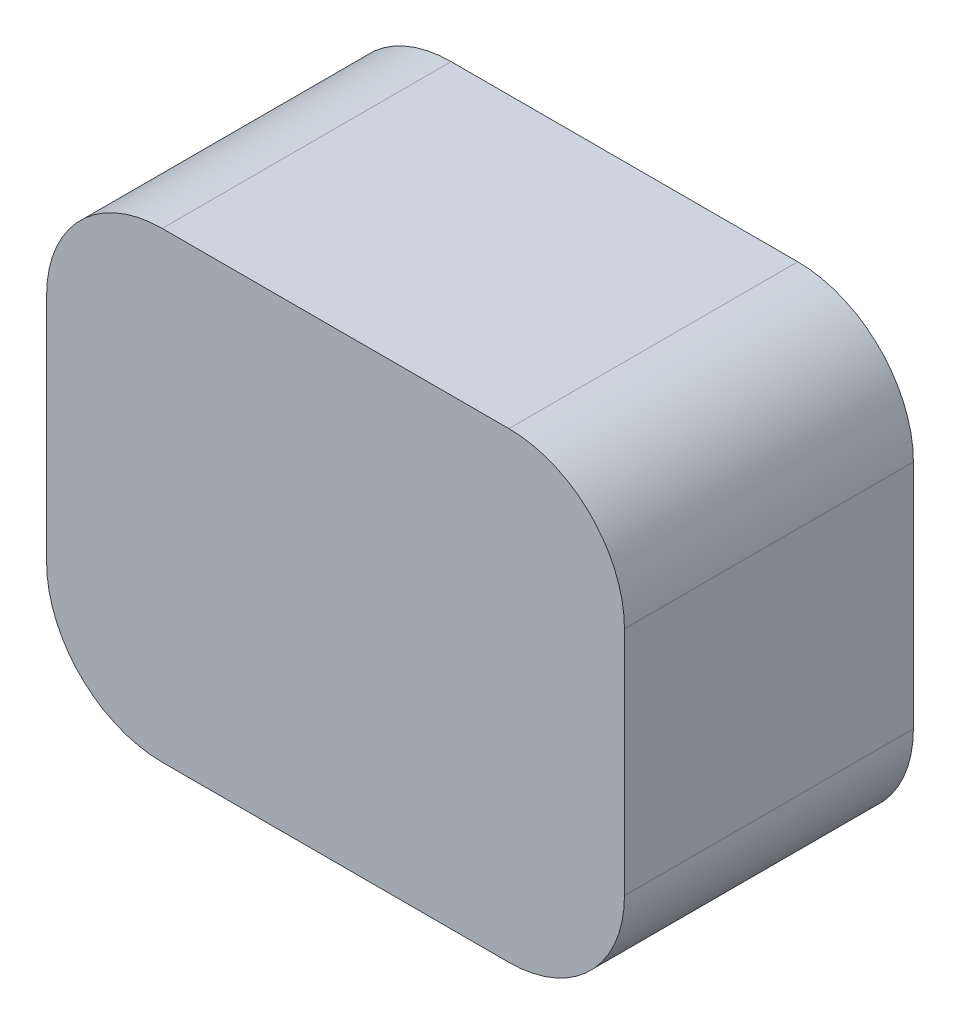
ISO-10303-21;
HEADER;
FILE_DESCRIPTION(('STEP AP214'),'2;1');
FILE_NAME('part.step','',(''),(''),'','','');
FILE_SCHEMA(('AUTOMOTIVE_DESIGN { 1 0 10303 214 1 1 1 1 }'));
ENDSEC;
DATA;
#1=APPLICATION_CONTEXT('core data for automotive mechanical design processes');
#2=APPLICATION_PROTOCOL_DEFINITION('international standard','automotive_design',2000,#1);
#3=PRODUCT_CONTEXT('',#1,'mechanical');
#4=PRODUCT('Part','Part','',(#3));
#5=PRODUCT_RELATED_PRODUCT_CATEGORY('part','',(#4));
#6=PRODUCT_DEFINITION_FORMATION('','',#4);
#7=PRODUCT_DEFINITION_CONTEXT('part definition',#1,'design');
#8=PRODUCT_DEFINITION('design','',#6,#7);
#9=PRODUCT_DEFINITION_SHAPE('','',#8);
#10=(LENGTH_UNIT() NAMED_UNIT(*) SI_UNIT(.MILLI.,.METRE.));
#11=(NAMED_UNIT(*) PLANE_ANGLE_UNIT() SI_UNIT($,.RADIAN.));
#12=(NAMED_UNIT(*) SI_UNIT($,.STERADIAN.) SOLID_ANGLE_UNIT());
#13=UNCERTAINTY_MEASURE_WITH_UNIT(LENGTH_MEASURE(1.E-05),#10,'distance_accuracy_value','');
#14=(GEOMETRIC_REPRESENTATION_CONTEXT(3) GLOBAL_UNCERTAINTY_ASSIGNED_CONTEXT((#13)) GLOBAL_UNIT_ASSIGNED_CONTEXT((#10,
#11,#12)) REPRESENTATION_CONTEXT('',''));
#15=CARTESIAN_POINT('',(0.,0.,0.));
#16=DIRECTION('',(0.,0.,1.));
#17=DIRECTION('',(1.,0.,0.));
#18=AXIS2_PLACEMENT_3D('',#15,#16,#17);
#19=CARTESIAN_POINT('',(-11.3079049054115,24.7793137313924,10.));
#20=DIRECTION('',(0.,0.,-1.));
#21=DIRECTION('',(-1.,0.,0.));
#22=AXIS2_PLACEMENT_3D('',#19,#20,#21);
#23=CYLINDRICAL_SURFACE('',#22,4.);
#24=CARTESIAN_POINT('',(-11.3079049054115,24.7793137313924,0.));
#25=DIRECTION('',(0.,0.,1.));
#26=DIRECTION('',(1.,0.,0.));
#27=AXIS2_PLACEMENT_3D('',#24,#25,#26);
#28=CIRCLE('',#27,4.);
#29=CARTESIAN_POINT('',(-11.3079049054115,20.7793137313924,0.));
#30=VERTEX_POINT('',#29);
#31=CARTESIAN_POINT('',(-7.30790490541148,24.7793137313925,0.));
#32=VERTEX_POINT('',#31);
#33=EDGE_CURVE('E146',#30,#32,#28,.T.);
#34=ORIENTED_EDGE('',*,*,#33,.T.);
#35=DIRECTION('',(0.,0.,-1.));
#36=VECTOR('',#35,1.);
#37=CARTESIAN_POINT('',(-7.30790490541148,24.7793137313925,10.));
#38=LINE('',#37,#36);
#39=CARTESIAN_POINT('',(-7.30790490541148,24.7793137313925,10.));
#40=VERTEX_POINT('',#39);
#41=EDGE_CURVE('E11',#40,#32,#38,.T.);
#42=ORIENTED_EDGE('',*,*,#41,.F.);
#43=CARTESIAN_POINT('',(-11.3079049054115,24.7793137313924,10.));
#44=DIRECTION('',(0.,0.,1.));
#45=DIRECTION('',(1.,0.,0.));
#46=AXIS2_PLACEMENT_3D('',#43,#44,#45);
#47=CIRCLE('',#46,4.);
#48=CARTESIAN_POINT('',(-11.3079049054115,20.7793137313924,10.));
#49=VERTEX_POINT('',#48);
#50=EDGE_CURVE('E168',#49,#40,#47,.T.);
#51=ORIENTED_EDGE('',*,*,#50,.F.);
#52=DIRECTION('',(0.,0.,-1.));
#53=VECTOR('',#52,1.);
#54=CARTESIAN_POINT('',(-11.3079049054115,20.7793137313924,10.));
#55=LINE('',#54,#53);
#56=EDGE_CURVE('E142',#49,#30,#55,.T.);
#57=ORIENTED_EDGE('',*,*,#56,.T.);
#58=EDGE_LOOP('',(#34,#42,#51,#57));
#59=FACE_BOUND('',#58,.T.);
#60=ADVANCED_FACE('F45',(#59),#23,.T.);
#61=CARTESIAN_POINT('',(-7.30790490541148,32.7793137313924,10.));
#62=DIRECTION('',(-1.,0.,0.));
#63=DIRECTION('',(0.,-1.,0.));
#64=AXIS2_PLACEMENT_3D('',#61,#62,#63);
#65=PLANE('',#64);
#66=DIRECTION('',(0.,1.,0.));
#67=VECTOR('',#66,1.);
#68=CARTESIAN_POINT('',(-7.30790490541148,32.7793137313924,0.));
#69=LINE('',#68,#67);
#70=CARTESIAN_POINT('',(-7.30790490541148,32.7793137313924,0.));
#71=VERTEX_POINT('',#70);
#72=EDGE_CURVE('E150',#32,#71,#69,.T.);
#73=ORIENTED_EDGE('',*,*,#72,.T.);
#74=DIRECTION('',(0.,0.,-1.));
#75=VECTOR('',#74,1.);
#76=CARTESIAN_POINT('',(-7.30790490541148,32.7793137313924,10.));
#77=LINE('',#76,#75);
#78=CARTESIAN_POINT('',(-7.30790490541148,32.7793137313924,10.));
#79=VERTEX_POINT('',#78);
#80=EDGE_CURVE('E54',#79,#71,#77,.T.);
#81=ORIENTED_EDGE('',*,*,#80,.F.);
#82=DIRECTION('',(0.,1.,0.));
#83=VECTOR('',#82,1.);
#84=CARTESIAN_POINT('',(-7.30790490541148,32.7793137313924,10.));
#85=LINE('',#84,#83);
#86=EDGE_CURVE('E105',#40,#79,#85,.T.);
#87=ORIENTED_EDGE('',*,*,#86,.F.);
#88=ORIENTED_EDGE('',*,*,#41,.T.);
#89=EDGE_LOOP('',(#73,#81,#87,#88));
#90=FACE_BOUND('',#89,.T.);
#91=ADVANCED_FACE('F214',(#90),#65,.F.);
#92=CARTESIAN_POINT('',(-11.3079049054115,32.7793137313924,10.));
#93=DIRECTION('',(0.,0.,-1.));
#94=DIRECTION('',(-1.,0.,0.));
#95=AXIS2_PLACEMENT_3D('',#92,#93,#94);
#96=CYLINDRICAL_SURFACE('',#95,4.);
#97=CARTESIAN_POINT('',(-11.3079049054115,32.7793137313924,0.));
#98=DIRECTION('',(0.,0.,1.));
#99=DIRECTION('',(-1.,0.,0.));
#100=AXIS2_PLACEMENT_3D('',#97,#98,#99);
#101=CIRCLE('',#100,4.);
#102=CARTESIAN_POINT('',(-11.3079049054115,36.7793137313924,0.));
#103=VERTEX_POINT('',#102);
#104=EDGE_CURVE('E153',#71,#103,#101,.T.);
#105=ORIENTED_EDGE('',*,*,#104,.T.);
#106=DIRECTION('',(0.,0.,-1.));
#107=VECTOR('',#106,1.);
#108=CARTESIAN_POINT('',(-11.3079049054115,36.7793137313924,10.));
#109=LINE('',#108,#107);
#110=CARTESIAN_POINT('',(-11.3079049054115,36.7793137313924,10.));
#111=VERTEX_POINT('',#110);
#112=EDGE_CURVE('E179',#111,#103,#109,.T.);
#113=ORIENTED_EDGE('',*,*,#112,.F.);
#114=CARTESIAN_POINT('',(-11.3079049054115,32.7793137313924,10.));
#115=DIRECTION('',(0.,0.,1.));
#116=DIRECTION('',(-1.,0.,0.));
#117=AXIS2_PLACEMENT_3D('',#114,#115,#116);
#118=CIRCLE('',#117,4.);
#119=EDGE_CURVE('E189',#79,#111,#118,.T.);
#120=ORIENTED_EDGE('',*,*,#119,.F.);
#121=ORIENTED_EDGE('',*,*,#80,.T.);
#122=EDGE_LOOP('',(#105,#113,#120,#121));
#123=FACE_BOUND('',#122,.T.);
#124=ADVANCED_FACE('F187',(#123),#96,.T.);
#125=CARTESIAN_POINT('',(-23.3079049054115,36.7793137313924,10.));
#126=DIRECTION('',(0.,-1.,0.));
#127=DIRECTION('',(0.,0.,-1.));
#128=AXIS2_PLACEMENT_3D('',#125,#126,#127);
#129=PLANE('',#128);
#130=DIRECTION('',(-1.,0.,0.));
#131=VECTOR('',#130,1.);
#132=CARTESIAN_POINT('',(-23.3079049054115,36.7793137313924,0.));
#133=LINE('',#132,#131);
#134=CARTESIAN_POINT('',(-23.3079049054115,36.7793137313924,0.));
#135=VERTEX_POINT('',#134);
#136=EDGE_CURVE('E156',#103,#135,#133,.T.);
#137=ORIENTED_EDGE('',*,*,#136,.T.);
#138=DIRECTION('',(0.,0.,-1.));
#139=VECTOR('',#138,1.);
#140=CARTESIAN_POINT('',(-23.3079049054115,36.7793137313924,10.));
#141=LINE('',#140,#139);
#142=CARTESIAN_POINT('',(-23.3079049054115,36.7793137313924,10.));
#143=VERTEX_POINT('',#142);
#144=EDGE_CURVE('E175',#143,#135,#141,.T.);
#145=ORIENTED_EDGE('',*,*,#144,.F.);
#146=DIRECTION('',(-1.,0.,0.));
#147=VECTOR('',#146,1.);
#148=CARTESIAN_POINT('',(-23.3079049054115,36.7793137313924,10.));
#149=LINE('',#148,#147);
#150=EDGE_CURVE('E202',#111,#143,#149,.T.);
#151=ORIENTED_EDGE('',*,*,#150,.F.);
#152=ORIENTED_EDGE('',*,*,#112,.T.);
#153=EDGE_LOOP('',(#137,#145,#151,#152));
#154=FACE_BOUND('',#153,.T.);
#155=ADVANCED_FACE('F197',(#154),#129,.F.);
#156=CARTESIAN_POINT('',(-23.3079049054115,32.7793137313924,10.));
#157=DIRECTION('',(0.,0.,-1.));
#158=DIRECTION('',(-1.,0.,0.));
#159=AXIS2_PLACEMENT_3D('',#156,#157,#158);
#160=CYLINDRICAL_SURFACE('',#159,4.);
#161=CARTESIAN_POINT('',(-23.3079049054115,32.7793137313924,0.));
#162=DIRECTION('',(0.,0.,1.));
#163=DIRECTION('',(1.,0.,0.));
#164=AXIS2_PLACEMENT_3D('',#161,#162,#163);
#165=CIRCLE('',#164,4.);
#166=CARTESIAN_POINT('',(-27.3079049054115,32.7793137313924,0.));
#167=VERTEX_POINT('',#166);
#168=EDGE_CURVE('E159',#135,#167,#165,.T.);
#169=ORIENTED_EDGE('',*,*,#168,.T.);
#170=DIRECTION('',(0.,0.,-1.));
#171=VECTOR('',#170,1.);
#172=CARTESIAN_POINT('',(-27.3079049054115,32.7793137313924,10.));
#173=LINE('',#172,#171);
#174=CARTESIAN_POINT('',(-27.3079049054115,32.7793137313924,10.));
#175=VERTEX_POINT('',#174);
#176=EDGE_CURVE('E135',#175,#167,#173,.T.);
#177=ORIENTED_EDGE('',*,*,#176,.F.);
#178=CARTESIAN_POINT('',(-23.3079049054115,32.7793137313924,10.));
#179=DIRECTION('',(0.,0.,1.));
#180=DIRECTION('',(1.,0.,0.));
#181=AXIS2_PLACEMENT_3D('',#178,#179,#180);
#182=CIRCLE('',#181,4.);
#183=EDGE_CURVE('E124',#143,#175,#182,.T.);
#184=ORIENTED_EDGE('',*,*,#183,.F.);
#185=ORIENTED_EDGE('',*,*,#144,.T.);
#186=EDGE_LOOP('',(#169,#177,#184,#185));
#187=FACE_BOUND('',#186,.T.);
#188=ADVANCED_FACE('F200',(#187),#160,.T.);
#189=CARTESIAN_POINT('',(-27.3079049054115,32.7793137313924,10.));
#190=DIRECTION('',(1.,0.,0.));
#191=DIRECTION('',(0.,1.,0.));
#192=AXIS2_PLACEMENT_3D('',#189,#190,#191);
#193=PLANE('',#192);
#194=DIRECTION('',(0.,-1.,0.));
#195=VECTOR('',#194,1.);
#196=CARTESIAN_POINT('',(-27.3079049054115,32.7793137313924,0.));
#197=LINE('',#196,#195);
#198=CARTESIAN_POINT('',(-27.3079049054115,24.7793137313924,0.));
#199=VERTEX_POINT('',#198);
#200=EDGE_CURVE('E133',#167,#199,#197,.T.);
#201=ORIENTED_EDGE('',*,*,#200,.T.);
#202=DIRECTION('',(0.,0.,-1.));
#203=VECTOR('',#202,1.);
#204=CARTESIAN_POINT('',(-27.3079049054115,24.7793137313924,10.));
#205=LINE('',#204,#203);
#206=CARTESIAN_POINT('',(-27.3079049054115,24.7793137313924,10.));
#207=VERTEX_POINT('',#206);
#208=EDGE_CURVE('E130',#207,#199,#205,.T.);
#209=ORIENTED_EDGE('',*,*,#208,.F.);
#210=DIRECTION('',(0.,-1.,0.));
#211=VECTOR('',#210,1.);
#212=CARTESIAN_POINT('',(-27.3079049054115,32.7793137313924,10.));
#213=LINE('',#212,#211);
#214=EDGE_CURVE('E118',#175,#207,#213,.T.);
#215=ORIENTED_EDGE('',*,*,#214,.F.);
#216=ORIENTED_EDGE('',*,*,#176,.T.);
#217=EDGE_LOOP('',(#201,#209,#215,#216));
#218=FACE_BOUND('',#217,.T.);
#219=ADVANCED_FACE('F131',(#218),#193,.F.);
#220=CARTESIAN_POINT('',(-23.3079049054115,24.7793137313924,10.));
#221=DIRECTION('',(0.,0.,-1.));
#222=DIRECTION('',(-1.,0.,0.));
#223=AXIS2_PLACEMENT_3D('',#220,#221,#222);
#224=CYLINDRICAL_SURFACE('',#223,4.);
#225=CARTESIAN_POINT('',(-23.3079049054115,24.7793137313924,0.));
#226=DIRECTION('',(0.,0.,1.));
#227=DIRECTION('',(-1.,0.,0.));
#228=AXIS2_PLACEMENT_3D('',#225,#226,#227);
#229=CIRCLE('',#228,4.);
#230=CARTESIAN_POINT('',(-23.3079049054115,20.7793137313924,0.));
#231=VERTEX_POINT('',#230);
#232=EDGE_CURVE('E91',#199,#231,#229,.T.);
#233=ORIENTED_EDGE('',*,*,#232,.T.);
#234=DIRECTION('',(0.,0.,-1.));
#235=VECTOR('',#234,1.);
#236=CARTESIAN_POINT('',(-23.3079049054115,20.7793137313924,10.));
#237=LINE('',#236,#235);
#238=CARTESIAN_POINT('',(-23.3079049054115,20.7793137313924,10.));
#239=VERTEX_POINT('',#238);
#240=EDGE_CURVE('E136',#239,#231,#237,.T.);
#241=ORIENTED_EDGE('',*,*,#240,.F.);
#242=CARTESIAN_POINT('',(-23.3079049054115,24.7793137313924,10.));
#243=DIRECTION('',(0.,0.,1.));
#244=DIRECTION('',(-1.,0.,0.));
#245=AXIS2_PLACEMENT_3D('',#242,#243,#244);
#246=CIRCLE('',#245,4.);
#247=EDGE_CURVE('E122',#207,#239,#246,.T.);
#248=ORIENTED_EDGE('',*,*,#247,.F.);
#249=ORIENTED_EDGE('',*,*,#208,.T.);
#250=EDGE_LOOP('',(#233,#241,#248,#249));
#251=FACE_BOUND('',#250,.T.);
#252=ADVANCED_FACE('F138',(#251),#224,.T.);
#253=CARTESIAN_POINT('',(-23.3079049054115,20.7793137313924,10.));
#254=DIRECTION('',(0.,1.,0.));
#255=DIRECTION('',(0.,0.,1.));
#256=AXIS2_PLACEMENT_3D('',#253,#254,#255);
#257=PLANE('',#256);
#258=DIRECTION('',(1.,0.,0.));
#259=VECTOR('',#258,1.);
#260=CARTESIAN_POINT('',(-23.3079049054115,20.7793137313924,0.));
#261=LINE('',#260,#259);
#262=EDGE_CURVE('E97',#231,#30,#261,.T.);
#263=ORIENTED_EDGE('',*,*,#262,.T.);
#264=ORIENTED_EDGE('',*,*,#56,.F.);
#265=DIRECTION('',(1.,0.,0.));
#266=VECTOR('',#265,1.);
#267=CARTESIAN_POINT('',(-23.3079049054115,20.7793137313924,10.));
#268=LINE('',#267,#266);
#269=EDGE_CURVE('E62',#239,#49,#268,.T.);
#270=ORIENTED_EDGE('',*,*,#269,.F.);
#271=ORIENTED_EDGE('',*,*,#240,.T.);
#272=EDGE_LOOP('',(#263,#264,#270,#271));
#273=FACE_BOUND('',#272,.T.);
#274=ADVANCED_FACE('F230',(#273),#257,.F.);
#275=CARTESIAN_POINT('',(-11.3079049054115,24.7793137313924,10.));
#276=DIRECTION('',(0.,0.,1.));
#277=DIRECTION('',(1.,0.,0.));
#278=AXIS2_PLACEMENT_3D('',#275,#276,#277);
#279=PLANE('',#278);
#280=ORIENTED_EDGE('',*,*,#50,.T.);
#281=ORIENTED_EDGE('',*,*,#86,.T.);
#282=ORIENTED_EDGE('',*,*,#119,.T.);
#283=ORIENTED_EDGE('',*,*,#150,.T.);
#284=ORIENTED_EDGE('',*,*,#183,.T.);
#285=ORIENTED_EDGE('',*,*,#214,.T.);
#286=ORIENTED_EDGE('',*,*,#247,.T.);
#287=ORIENTED_EDGE('',*,*,#269,.T.);
#288=EDGE_LOOP('',(#280,#281,#282,#283,#284,#285,#286,#287));
#289=FACE_BOUND('',#288,.T.);
#290=ADVANCED_FACE('F120',(#289),#279,.T.);
#291=CARTESIAN_POINT('',(-11.3079049054115,24.7793137313924,0.));
#292=DIRECTION('',(0.,0.,1.));
#293=DIRECTION('',(1.,0.,0.));
#294=AXIS2_PLACEMENT_3D('',#291,#292,#293);
#295=PLANE('',#294);
#296=ORIENTED_EDGE('',*,*,#33,.F.);
#297=ORIENTED_EDGE('',*,*,#262,.F.);
#298=ORIENTED_EDGE('',*,*,#232,.F.);
#299=ORIENTED_EDGE('',*,*,#200,.F.);
#300=ORIENTED_EDGE('',*,*,#168,.F.);
#301=ORIENTED_EDGE('',*,*,#136,.F.);
#302=ORIENTED_EDGE('',*,*,#104,.F.);
#303=ORIENTED_EDGE('',*,*,#72,.F.);
#304=EDGE_LOOP('',(#296,#297,#298,#299,#300,#301,#302,#303));
#305=FACE_BOUND('',#304,.T.);
#306=ADVANCED_FACE('F193',(#305),#295,.F.);
#307=CLOSED_SHELL('',(#60,#91,#124,#155,#188,#219,#252,#274,#290,#306));
#308=MANIFOLD_SOLID_BREP('B2',#307);
#309=ADVANCED_BREP_SHAPE_REPRESENTATION('',(#18,#308),#14);
#310=SHAPE_DEFINITION_REPRESENTATION(#9,#309);
ENDSEC;
END-ISO-10303-21;
